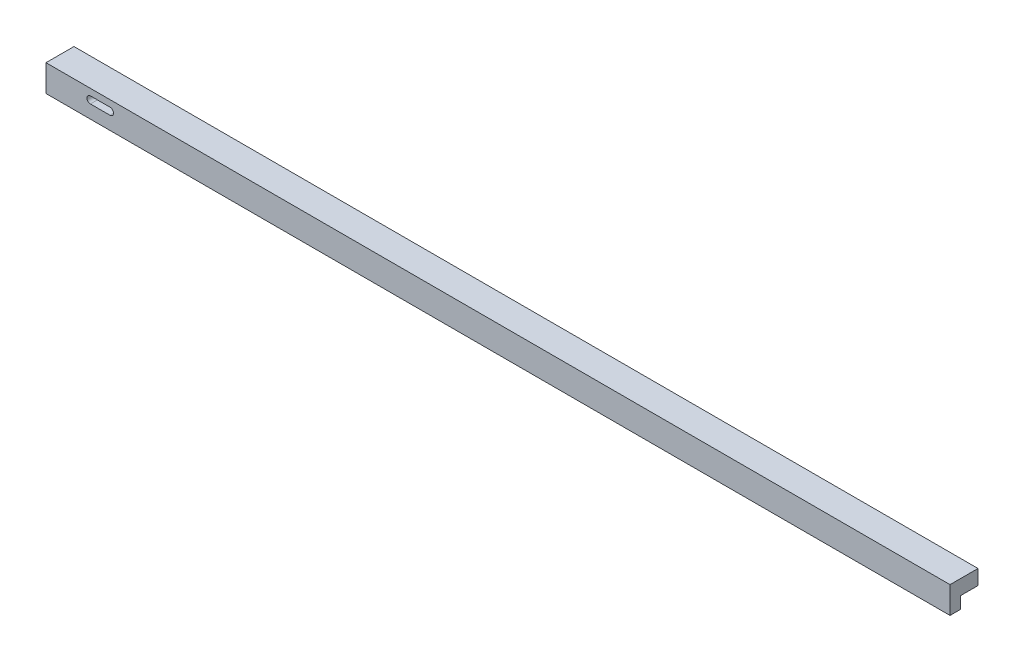
ISO-10303-21;
HEADER;
FILE_DESCRIPTION(('STEP AP214'),'2;1');
FILE_NAME('part.step','',(''),(''),'','','');
FILE_SCHEMA(('AUTOMOTIVE_DESIGN { 1 0 10303 214 1 1 1 1 }'));
ENDSEC;
DATA;
#1=APPLICATION_CONTEXT('core data for automotive mechanical design processes');
#2=APPLICATION_PROTOCOL_DEFINITION('international standard','automotive_design',2000,#1);
#3=PRODUCT_CONTEXT('',#1,'mechanical');
#4=PRODUCT('Part','Part','',(#3));
#5=PRODUCT_RELATED_PRODUCT_CATEGORY('part','',(#4));
#6=PRODUCT_DEFINITION_FORMATION('','',#4);
#7=PRODUCT_DEFINITION_CONTEXT('part definition',#1,'design');
#8=PRODUCT_DEFINITION('design','',#6,#7);
#9=PRODUCT_DEFINITION_SHAPE('','',#8);
#10=(LENGTH_UNIT() NAMED_UNIT(*) SI_UNIT(.MILLI.,.METRE.));
#11=(NAMED_UNIT(*) PLANE_ANGLE_UNIT() SI_UNIT($,.RADIAN.));
#12=(NAMED_UNIT(*) SI_UNIT($,.STERADIAN.) SOLID_ANGLE_UNIT());
#13=UNCERTAINTY_MEASURE_WITH_UNIT(LENGTH_MEASURE(1.E-05),#10,'distance_accuracy_value','');
#14=(GEOMETRIC_REPRESENTATION_CONTEXT(3) GLOBAL_UNCERTAINTY_ASSIGNED_CONTEXT((#13)) GLOBAL_UNIT_ASSIGNED_CONTEXT((#10,
#11,#12)) REPRESENTATION_CONTEXT('',''));
#15=CARTESIAN_POINT('',(0.,0.,0.));
#16=DIRECTION('',(0.,0.,1.));
#17=DIRECTION('',(1.,0.,0.));
#18=AXIS2_PLACEMENT_3D('',#15,#16,#17);
#19=CARTESIAN_POINT('',(1.69385725672636E-13,24.257,0.));
#20=DIRECTION('',(0.,1.,0.));
#21=DIRECTION('',(0.,0.,-1.));
#22=AXIS2_PLACEMENT_3D('',#19,#20,#21);
#23=PLANE('',#22);
#24=DIRECTION('',(0.,0.,-1.));
#25=VECTOR('',#24,1.);
#26=CARTESIAN_POINT('',(-410.36875,24.2569999999971,257.175));
#27=LINE('',#26,#25);
#28=CARTESIAN_POINT('',(-410.36875,24.2569999999971,257.175));
#29=VERTEX_POINT('',#28);
#30=CARTESIAN_POINT('',(-410.36875,24.2569999999971,231.775));
#31=VERTEX_POINT('',#30);
#32=EDGE_CURVE('E40',#29,#31,#27,.T.);
#33=ORIENTED_EDGE('',*,*,#32,.F.);
#34=DIRECTION('',(-1.,0.,0.));
#35=VECTOR('',#34,1.);
#36=CARTESIAN_POINT('',(-410.36875,24.2569999999971,257.175));
#37=LINE('',#36,#35);
#38=CARTESIAN_POINT('',(410.36875,24.2570000000029,257.175));
#39=VERTEX_POINT('',#38);
#40=EDGE_CURVE('E193',#39,#29,#37,.T.);
#41=ORIENTED_EDGE('',*,*,#40,.F.);
#42=DIRECTION('',(0.,0.,1.));
#43=VECTOR('',#42,1.);
#44=CARTESIAN_POINT('',(410.36875,24.2570000000029,257.175));
#45=LINE('',#44,#43);
#46=CARTESIAN_POINT('',(410.36875,24.2570000000029,231.775));
#47=VERTEX_POINT('',#46);
#48=EDGE_CURVE('E197',#47,#39,#45,.T.);
#49=ORIENTED_EDGE('',*,*,#48,.F.);
#50=DIRECTION('',(1.,0.,0.));
#51=VECTOR('',#50,1.);
#52=CARTESIAN_POINT('',(-410.36875,24.2569999999971,231.775));
#53=LINE('',#52,#51);
#54=EDGE_CURVE('E186',#31,#47,#53,.T.);
#55=ORIENTED_EDGE('',*,*,#54,.F.);
#56=EDGE_LOOP('',(#33,#41,#49,#55));
#57=FACE_BOUND('',#56,.T.);
#58=ADVANCED_FACE('F32',(#57),#23,.T.);
#59=CARTESIAN_POINT('',(2.63390369239648E-13,10.795,0.));
#60=DIRECTION('',(0.,-1.,0.));
#61=DIRECTION('',(0.,0.,1.));
#62=AXIS2_PLACEMENT_3D('',#59,#60,#61);
#63=PLANE('',#62);
#64=DIRECTION('',(1.,0.,0.));
#65=VECTOR('',#64,1.);
#66=CARTESIAN_POINT('',(410.36875,10.7950000000029,247.65));
#67=LINE('',#66,#65);
#68=CARTESIAN_POINT('',(-410.36875,10.7949999999971,247.65));
#69=VERTEX_POINT('',#68);
#70=CARTESIAN_POINT('',(410.36875,10.7950000000029,247.65));
#71=VERTEX_POINT('',#70);
#72=EDGE_CURVE('E158',#69,#71,#67,.T.);
#73=ORIENTED_EDGE('',*,*,#72,.F.);
#74=DIRECTION('',(0.,0.,-1.));
#75=VECTOR('',#74,1.);
#76=CARTESIAN_POINT('',(-410.36875,10.7949999999971,257.175));
#77=LINE('',#76,#75);
#78=CARTESIAN_POINT('',(-410.36875,10.7949999999971,231.775));
#79=VERTEX_POINT('',#78);
#80=EDGE_CURVE('E175',#69,#79,#77,.T.);
#81=ORIENTED_EDGE('',*,*,#80,.T.);
#82=DIRECTION('',(1.,0.,0.));
#83=VECTOR('',#82,1.);
#84=CARTESIAN_POINT('',(-410.36875,10.7949999999971,231.775));
#85=LINE('',#84,#83);
#86=CARTESIAN_POINT('',(410.36875,10.7950000000029,231.775));
#87=VERTEX_POINT('',#86);
#88=EDGE_CURVE('E178',#79,#87,#85,.T.);
#89=ORIENTED_EDGE('',*,*,#88,.T.);
#90=DIRECTION('',(0.,0.,1.));
#91=VECTOR('',#90,1.);
#92=CARTESIAN_POINT('',(410.36875,10.7950000000029,257.175));
#93=LINE('',#92,#91);
#94=EDGE_CURVE('E168',#87,#71,#93,.T.);
#95=ORIENTED_EDGE('',*,*,#94,.T.);
#96=EDGE_LOOP('',(#73,#81,#89,#95));
#97=FACE_BOUND('',#96,.T.);
#98=ADVANCED_FACE('F210',(#97),#63,.T.);
#99=CARTESIAN_POINT('',(-410.368750000005,845.387442686328,231.775));
#100=DIRECTION('',(0.,0.,-1.));
#101=DIRECTION('',(1.,0.,0.));
#102=AXIS2_PLACEMENT_3D('',#99,#100,#101);
#103=PLANE('',#102);
#104=CARTESIAN_POINT('',(-370.04625,15.1510999999974,231.775));
#105=DIRECTION('',(0.,0.,-1.));
#106=DIRECTION('',(-1.,0.,0.));
#107=AXIS2_PLACEMENT_3D('',#104,#105,#106);
#108=CIRCLE('',#107,3.175);
#109=CARTESIAN_POINT('',(-370.04625,11.9760999999974,231.775));
#110=VERTEX_POINT('',#109);
#111=CARTESIAN_POINT('',(-370.04625,18.3260999999975,231.775));
#112=VERTEX_POINT('',#111);
#113=EDGE_CURVE('E116',#110,#112,#108,.T.);
#114=ORIENTED_EDGE('',*,*,#113,.F.);
#115=DIRECTION('',(-1.,0.,0.));
#116=VECTOR('',#115,1.);
#117=CARTESIAN_POINT('',(-410.368750000006,11.9760999999974,231.775));
#118=LINE('',#117,#116);
#119=CARTESIAN_POINT('',(-352.26625,11.9760999999974,231.775));
#120=VERTEX_POINT('',#119);
#121=EDGE_CURVE('E143',#120,#110,#118,.T.);
#122=ORIENTED_EDGE('',*,*,#121,.F.);
#123=CARTESIAN_POINT('',(-352.26625,15.1510999999974,231.775));
#124=DIRECTION('',(0.,0.,-1.));
#125=DIRECTION('',(-1.,0.,0.));
#126=AXIS2_PLACEMENT_3D('',#123,#124,#125);
#127=CIRCLE('',#126,3.175);
#128=CARTESIAN_POINT('',(-352.26625,18.3260999999974,231.775));
#129=VERTEX_POINT('',#128);
#130=EDGE_CURVE('E141',#129,#120,#127,.T.);
#131=ORIENTED_EDGE('',*,*,#130,.F.);
#132=DIRECTION('',(1.,0.,0.));
#133=VECTOR('',#132,1.);
#134=CARTESIAN_POINT('',(-410.368750000006,18.3260999999975,231.775));
#135=LINE('',#134,#133);
#136=EDGE_CURVE('E135',#112,#129,#135,.T.);
#137=ORIENTED_EDGE('',*,*,#136,.F.);
#138=EDGE_LOOP('',(#114,#122,#131,#137));
#139=FACE_BOUND('',#138,.T.);
#140=DIRECTION('',(0.,-1.,0.));
#141=VECTOR('',#140,1.);
#142=CARTESIAN_POINT('',(-410.368750000005,845.387442686328,231.775));
#143=LINE('',#142,#141);
#144=EDGE_CURVE('E11',#31,#79,#143,.T.);
#145=ORIENTED_EDGE('',*,*,#144,.F.);
#146=ORIENTED_EDGE('',*,*,#54,.T.);
#147=DIRECTION('',(0.,-1.,0.));
#148=VECTOR('',#147,1.);
#149=CARTESIAN_POINT('',(410.368749999995,845.387442686334,231.775));
#150=LINE('',#149,#148);
#151=EDGE_CURVE('E189',#47,#87,#150,.T.);
#152=ORIENTED_EDGE('',*,*,#151,.T.);
#153=ORIENTED_EDGE('',*,*,#88,.F.);
#154=EDGE_LOOP('',(#145,#146,#152,#153));
#155=FACE_BOUND('',#154,.T.);
#156=ADVANCED_FACE('F206',(#139,#155),#103,.T.);
#157=CARTESIAN_POINT('',(410.368749999995,845.387442686334,257.175));
#158=DIRECTION('',(1.,0.,0.));
#159=DIRECTION('',(0.,0.,1.));
#160=AXIS2_PLACEMENT_3D('',#157,#158,#159);
#161=PLANE('',#160);
#162=ORIENTED_EDGE('',*,*,#151,.F.);
#163=ORIENTED_EDGE('',*,*,#48,.T.);
#164=DIRECTION('',(0.,-1.,0.));
#165=VECTOR('',#164,1.);
#166=CARTESIAN_POINT('',(410.368749999995,845.387442686334,257.175));
#167=LINE('',#166,#165);
#168=CARTESIAN_POINT('',(410.36875,2.86576318231369E-12,257.175));
#169=VERTEX_POINT('',#168);
#170=EDGE_CURVE('E196',#39,#169,#167,.T.);
#171=ORIENTED_EDGE('',*,*,#170,.T.);
#172=DIRECTION('',(0.,0.,1.));
#173=VECTOR('',#172,1.);
#174=CARTESIAN_POINT('',(410.36875,2.86576318231369E-12,247.65));
#175=LINE('',#174,#173);
#176=CARTESIAN_POINT('',(410.36875,2.86576318231369E-12,247.65));
#177=VERTEX_POINT('',#176);
#178=EDGE_CURVE('E146',#177,#169,#175,.T.);
#179=ORIENTED_EDGE('',*,*,#178,.F.);
#180=DIRECTION('',(0.,1.,0.));
#181=VECTOR('',#180,1.);
#182=CARTESIAN_POINT('',(410.36875,3.17500000000287,247.65));
#183=LINE('',#182,#181);
#184=EDGE_CURVE('E167',#177,#71,#183,.T.);
#185=ORIENTED_EDGE('',*,*,#184,.T.);
#186=ORIENTED_EDGE('',*,*,#94,.F.);
#187=EDGE_LOOP('',(#162,#163,#171,#179,#185,#186));
#188=FACE_BOUND('',#187,.T.);
#189=ADVANCED_FACE('F208',(#188),#161,.T.);
#190=CARTESIAN_POINT('',(-410.368750000005,845.387442686328,257.175));
#191=DIRECTION('',(0.,0.,1.));
#192=DIRECTION('',(-1.,0.,0.));
#193=AXIS2_PLACEMENT_3D('',#190,#191,#192);
#194=PLANE('',#193);
#195=CARTESIAN_POINT('',(-370.04625,15.1510999999974,257.175));
#196=DIRECTION('',(0.,0.,-1.));
#197=DIRECTION('',(-1.,0.,0.));
#198=AXIS2_PLACEMENT_3D('',#195,#196,#197);
#199=CIRCLE('',#198,3.175);
#200=CARTESIAN_POINT('',(-370.04625,11.9760999999974,257.175));
#201=VERTEX_POINT('',#200);
#202=CARTESIAN_POINT('',(-370.04625,18.3260999999974,257.175));
#203=VERTEX_POINT('',#202);
#204=EDGE_CURVE('E113',#201,#203,#199,.T.);
#205=ORIENTED_EDGE('',*,*,#204,.T.);
#206=DIRECTION('',(1.,0.,0.));
#207=VECTOR('',#206,1.);
#208=CARTESIAN_POINT('',(-370.04625,18.3260999999974,257.175));
#209=LINE('',#208,#207);
#210=CARTESIAN_POINT('',(-352.26625,18.3260999999974,257.175));
#211=VERTEX_POINT('',#210);
#212=EDGE_CURVE('E122',#203,#211,#209,.T.);
#213=ORIENTED_EDGE('',*,*,#212,.T.);
#214=CARTESIAN_POINT('',(-352.26625,15.1510999999974,257.175));
#215=DIRECTION('',(0.,0.,-1.));
#216=DIRECTION('',(-1.,0.,0.));
#217=AXIS2_PLACEMENT_3D('',#214,#215,#216);
#218=CIRCLE('',#217,3.175);
#219=CARTESIAN_POINT('',(-352.26625,11.9760999999974,257.175));
#220=VERTEX_POINT('',#219);
#221=EDGE_CURVE('E56',#211,#220,#218,.T.);
#222=ORIENTED_EDGE('',*,*,#221,.T.);
#223=DIRECTION('',(-1.,0.,0.));
#224=VECTOR('',#223,1.);
#225=CARTESIAN_POINT('',(-370.04625,11.9760999999974,257.175));
#226=LINE('',#225,#224);
#227=EDGE_CURVE('E119',#220,#201,#226,.T.);
#228=ORIENTED_EDGE('',*,*,#227,.T.);
#229=EDGE_LOOP('',(#205,#213,#222,#228));
#230=FACE_BOUND('',#229,.T.);
#231=ORIENTED_EDGE('',*,*,#170,.F.);
#232=ORIENTED_EDGE('',*,*,#40,.T.);
#233=DIRECTION('',(0.,-1.,0.));
#234=VECTOR('',#233,1.);
#235=CARTESIAN_POINT('',(-410.368750000005,845.387442686328,257.175));
#236=LINE('',#235,#234);
#237=CARTESIAN_POINT('',(-410.368749999999,-2.86576318231369E-12,257.175));
#238=VERTEX_POINT('',#237);
#239=EDGE_CURVE('E192',#29,#238,#236,.T.);
#240=ORIENTED_EDGE('',*,*,#239,.T.);
#241=DIRECTION('',(-1.,0.,0.));
#242=VECTOR('',#241,1.);
#243=CARTESIAN_POINT('',(410.36875,2.86576318231369E-12,257.175));
#244=LINE('',#243,#242);
#245=EDGE_CURVE('E149',#169,#238,#244,.T.);
#246=ORIENTED_EDGE('',*,*,#245,.F.);
#247=EDGE_LOOP('',(#231,#232,#240,#246));
#248=FACE_BOUND('',#247,.T.);
#249=ADVANCED_FACE('F126',(#230,#248),#194,.T.);
#250=CARTESIAN_POINT('',(-410.368750000005,845.387442686328,257.175));
#251=DIRECTION('',(-1.,0.,0.));
#252=DIRECTION('',(0.,0.,-1.));
#253=AXIS2_PLACEMENT_3D('',#250,#251,#252);
#254=PLANE('',#253);
#255=ORIENTED_EDGE('',*,*,#239,.F.);
#256=ORIENTED_EDGE('',*,*,#32,.T.);
#257=ORIENTED_EDGE('',*,*,#144,.T.);
#258=ORIENTED_EDGE('',*,*,#80,.F.);
#259=DIRECTION('',(0.,1.,0.));
#260=VECTOR('',#259,1.);
#261=CARTESIAN_POINT('',(-410.368749999999,3.17499999999714,247.65));
#262=LINE('',#261,#260);
#263=CARTESIAN_POINT('',(-410.368749999999,-2.86576318231369E-12,247.65));
#264=VERTEX_POINT('',#263);
#265=EDGE_CURVE('E172',#264,#69,#262,.T.);
#266=ORIENTED_EDGE('',*,*,#265,.F.);
#267=DIRECTION('',(0.,0.,-1.));
#268=VECTOR('',#267,1.);
#269=CARTESIAN_POINT('',(-410.368749999999,-2.86576318231369E-12,257.175));
#270=LINE('',#269,#268);
#271=EDGE_CURVE('E152',#238,#264,#270,.T.);
#272=ORIENTED_EDGE('',*,*,#271,.F.);
#273=EDGE_LOOP('',(#255,#256,#257,#258,#266,#272));
#274=FACE_BOUND('',#273,.T.);
#275=ADVANCED_FACE('F223',(#274),#254,.T.);
#276=CARTESIAN_POINT('',(410.36875,3.17500000000287,247.65));
#277=DIRECTION('',(0.,0.,1.));
#278=DIRECTION('',(-1.,0.,0.));
#279=AXIS2_PLACEMENT_3D('',#276,#277,#278);
#280=PLANE('',#279);
#281=ORIENTED_EDGE('',*,*,#72,.T.);
#282=ORIENTED_EDGE('',*,*,#184,.F.);
#283=DIRECTION('',(1.,0.,0.));
#284=VECTOR('',#283,1.);
#285=CARTESIAN_POINT('',(-410.368749999999,-2.86576318231369E-12,247.65));
#286=LINE('',#285,#284);
#287=EDGE_CURVE('E155',#264,#177,#286,.T.);
#288=ORIENTED_EDGE('',*,*,#287,.F.);
#289=ORIENTED_EDGE('',*,*,#265,.T.);
#290=EDGE_LOOP('',(#281,#282,#288,#289));
#291=FACE_BOUND('',#290,.T.);
#292=ADVANCED_FACE('F221',(#291),#280,.F.);
#293=CARTESIAN_POINT('',(3.38771451345272E-13,0.,0.));
#294=DIRECTION('',(0.,-1.,0.));
#295=DIRECTION('',(0.,0.,1.));
#296=AXIS2_PLACEMENT_3D('',#293,#294,#295);
#297=PLANE('',#296);
#298=ORIENTED_EDGE('',*,*,#178,.T.);
#299=ORIENTED_EDGE('',*,*,#245,.T.);
#300=ORIENTED_EDGE('',*,*,#271,.T.);
#301=ORIENTED_EDGE('',*,*,#287,.T.);
#302=EDGE_LOOP('',(#298,#299,#300,#301));
#303=FACE_BOUND('',#302,.T.);
#304=ADVANCED_FACE('F254',(#303),#297,.T.);
#305=CARTESIAN_POINT('',(-370.04625,15.1510999999974,257.175));
#306=DIRECTION('',(0.,0.,-1.));
#307=DIRECTION('',(-1.,0.,0.));
#308=AXIS2_PLACEMENT_3D('',#305,#306,#307);
#309=CYLINDRICAL_SURFACE('',#308,3.175);
#310=ORIENTED_EDGE('',*,*,#113,.T.);
#311=DIRECTION('',(0.,0.,-1.));
#312=VECTOR('',#311,1.);
#313=CARTESIAN_POINT('',(-370.04625,18.3260999999974,257.175));
#314=LINE('',#313,#312);
#315=EDGE_CURVE('E48',#203,#112,#314,.T.);
#316=ORIENTED_EDGE('',*,*,#315,.F.);
#317=ORIENTED_EDGE('',*,*,#204,.F.);
#318=DIRECTION('',(0.,0.,-1.));
#319=VECTOR('',#318,1.);
#320=CARTESIAN_POINT('',(-370.04625,11.9760999999974,257.175));
#321=LINE('',#320,#319);
#322=EDGE_CURVE('E133',#201,#110,#321,.T.);
#323=ORIENTED_EDGE('',*,*,#322,.T.);
#324=EDGE_LOOP('',(#310,#316,#317,#323));
#325=FACE_BOUND('',#324,.T.);
#326=ADVANCED_FACE('F110',(#325),#309,.F.);
#327=CARTESIAN_POINT('',(-370.04625,11.9760999999974,257.175));
#328=DIRECTION('',(0.,-1.,0.));
#329=DIRECTION('',(1.,0.,0.));
#330=AXIS2_PLACEMENT_3D('',#327,#328,#329);
#331=PLANE('',#330);
#332=ORIENTED_EDGE('',*,*,#121,.T.);
#333=ORIENTED_EDGE('',*,*,#322,.F.);
#334=ORIENTED_EDGE('',*,*,#227,.F.);
#335=DIRECTION('',(0.,0.,-1.));
#336=VECTOR('',#335,1.);
#337=CARTESIAN_POINT('',(-352.26625,11.9760999999974,257.175));
#338=LINE('',#337,#336);
#339=EDGE_CURVE('E136',#220,#120,#338,.T.);
#340=ORIENTED_EDGE('',*,*,#339,.T.);
#341=EDGE_LOOP('',(#332,#333,#334,#340));
#342=FACE_BOUND('',#341,.T.);
#343=ADVANCED_FACE('F267',(#342),#331,.F.);
#344=CARTESIAN_POINT('',(-352.26625,15.1510999999974,257.175));
#345=DIRECTION('',(0.,0.,-1.));
#346=DIRECTION('',(-1.,0.,0.));
#347=AXIS2_PLACEMENT_3D('',#344,#345,#346);
#348=CYLINDRICAL_SURFACE('',#347,3.175);
#349=ORIENTED_EDGE('',*,*,#130,.T.);
#350=ORIENTED_EDGE('',*,*,#339,.F.);
#351=ORIENTED_EDGE('',*,*,#221,.F.);
#352=DIRECTION('',(0.,0.,-1.));
#353=VECTOR('',#352,1.);
#354=CARTESIAN_POINT('',(-352.26625,18.3260999999974,257.175));
#355=LINE('',#354,#353);
#356=EDGE_CURVE('E118',#211,#129,#355,.T.);
#357=ORIENTED_EDGE('',*,*,#356,.T.);
#358=EDGE_LOOP('',(#349,#350,#351,#357));
#359=FACE_BOUND('',#358,.T.);
#360=ADVANCED_FACE('F275',(#359),#348,.F.);
#361=CARTESIAN_POINT('',(-370.04625,18.3260999999974,257.175));
#362=DIRECTION('',(0.,1.,0.));
#363=DIRECTION('',(-1.,0.,0.));
#364=AXIS2_PLACEMENT_3D('',#361,#362,#363);
#365=PLANE('',#364);
#366=ORIENTED_EDGE('',*,*,#136,.T.);
#367=ORIENTED_EDGE('',*,*,#356,.F.);
#368=ORIENTED_EDGE('',*,*,#212,.F.);
#369=ORIENTED_EDGE('',*,*,#315,.T.);
#370=EDGE_LOOP('',(#366,#367,#368,#369));
#371=FACE_BOUND('',#370,.T.);
#372=ADVANCED_FACE('F123',(#371),#365,.F.);
#373=CLOSED_SHELL('',(#58,#98,#156,#189,#249,#275,#292,#304,#326,#343,#360,#372));
#374=MANIFOLD_SOLID_BREP('B2',#373);
#375=ADVANCED_BREP_SHAPE_REPRESENTATION('',(#18,#374),#14);
#376=SHAPE_DEFINITION_REPRESENTATION(#9,#375);
ENDSEC;
END-ISO-10303-21;
